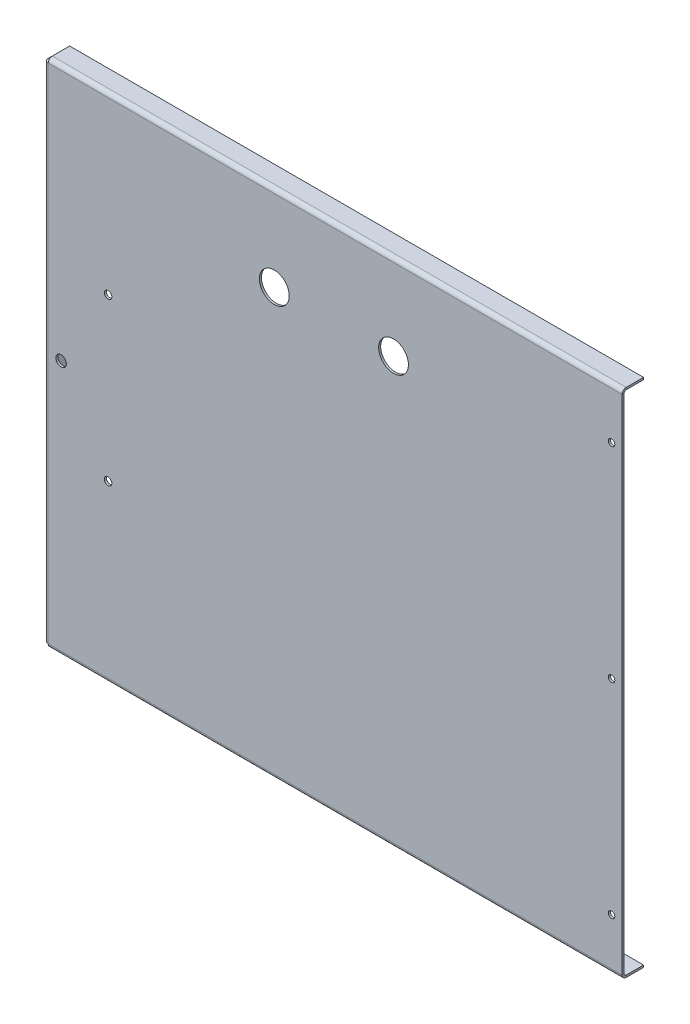
ISO-10303-21;
HEADER;
FILE_DESCRIPTION(('STEP AP214'),'2;1');
FILE_NAME('part.step','',(''),(''),'','','');
FILE_SCHEMA(('AUTOMOTIVE_DESIGN { 1 0 10303 214 1 1 1 1 }'));
ENDSEC;
DATA;
#1=APPLICATION_CONTEXT('core data for automotive mechanical design processes');
#2=APPLICATION_PROTOCOL_DEFINITION('international standard','automotive_design',2000,#1);
#3=PRODUCT_CONTEXT('',#1,'mechanical');
#4=PRODUCT('Part','Part','',(#3));
#5=PRODUCT_RELATED_PRODUCT_CATEGORY('part','',(#4));
#6=PRODUCT_DEFINITION_FORMATION('','',#4);
#7=PRODUCT_DEFINITION_CONTEXT('part definition',#1,'design');
#8=PRODUCT_DEFINITION('design','',#6,#7);
#9=PRODUCT_DEFINITION_SHAPE('','',#8);
#10=(LENGTH_UNIT() NAMED_UNIT(*) SI_UNIT(.MILLI.,.METRE.));
#11=(NAMED_UNIT(*) PLANE_ANGLE_UNIT() SI_UNIT($,.RADIAN.));
#12=(NAMED_UNIT(*) SI_UNIT($,.STERADIAN.) SOLID_ANGLE_UNIT());
#13=UNCERTAINTY_MEASURE_WITH_UNIT(LENGTH_MEASURE(1.E-05),#10,'distance_accuracy_value','');
#14=(GEOMETRIC_REPRESENTATION_CONTEXT(3) GLOBAL_UNCERTAINTY_ASSIGNED_CONTEXT((#13)) GLOBAL_UNIT_ASSIGNED_CONTEXT((#10,
#11,#12)) REPRESENTATION_CONTEXT('',''));
#15=CARTESIAN_POINT('',(0.,0.,0.));
#16=DIRECTION('',(0.,0.,1.));
#17=DIRECTION('',(1.,0.,0.));
#18=AXIS2_PLACEMENT_3D('',#15,#16,#17);
#19=CARTESIAN_POINT('',(-215.519,187.3758,-111.252));
#20=DIRECTION('',(0.,-1.,0.));
#21=DIRECTION('',(0.,0.,-1.));
#22=AXIS2_PLACEMENT_3D('',#19,#20,#21);
#23=PLANE('',#22);
#24=DIRECTION('',(1.,0.,0.));
#25=VECTOR('',#24,1.);
#26=CARTESIAN_POINT('',(0.,187.3758,-1.524));
#27=LINE('',#26,#25);
#28=CARTESIAN_POINT('',(-212.471,187.3758,-1.524));
#29=VERTEX_POINT('',#28);
#30=CARTESIAN_POINT('',(-212.3948,187.3758,-1.524));
#31=VERTEX_POINT('',#30);
#32=EDGE_CURVE('E330',#29,#31,#27,.T.);
#33=ORIENTED_EDGE('',*,*,#32,.F.);
#34=DIRECTION('',(0.,0.,1.));
#35=VECTOR('',#34,1.);
#36=CARTESIAN_POINT('',(-212.471,187.3758,-1.524));
#37=LINE('',#36,#35);
#38=CARTESIAN_POINT('',(-212.471,187.3758,0.));
#39=VERTEX_POINT('',#38);
#40=EDGE_CURVE('E13',#29,#39,#37,.T.);
#41=ORIENTED_EDGE('',*,*,#40,.T.);
#42=DIRECTION('',(1.,0.,0.));
#43=VECTOR('',#42,1.);
#44=CARTESIAN_POINT('',(-215.519,187.3758,0.));
#45=LINE('',#44,#43);
#46=CARTESIAN_POINT('',(-212.3948,187.3758,0.));
#47=VERTEX_POINT('',#46);
#48=EDGE_CURVE('E263',#39,#47,#45,.T.);
#49=ORIENTED_EDGE('',*,*,#48,.T.);
#50=DIRECTION('',(0.,0.,1.));
#51=VECTOR('',#50,1.);
#52=CARTESIAN_POINT('',(-212.3948,187.3758,-111.252));
#53=LINE('',#52,#51);
#54=EDGE_CURVE('E247',#31,#47,#53,.T.);
#55=ORIENTED_EDGE('',*,*,#54,.F.);
#56=EDGE_LOOP('',(#33,#41,#49,#55));
#57=FACE_BOUND('',#56,.T.);
#58=ADVANCED_FACE('F110',(#57),#23,.F.);
#59=DIRECTION('',(0.,0.,1.));
#60=VECTOR('',#59,1.);
#61=CARTESIAN_POINT('',(-215.519,187.3758,-111.252));
#62=LINE('',#61,#60);
#63=CARTESIAN_POINT('',(-215.519,187.3758,-16.002));
#64=VERTEX_POINT('',#63);
#65=CARTESIAN_POINT('',(-215.519,187.3758,-3.048));
#66=VERTEX_POINT('',#65);
#67=EDGE_CURVE('E259',#64,#66,#62,.T.);
#68=ORIENTED_EDGE('',*,*,#67,.T.);
#69=DIRECTION('',(1.,0.,0.));
#70=VECTOR('',#69,1.);
#71=CARTESIAN_POINT('',(-215.519,187.3758,-3.048));
#72=LINE('',#71,#70);
#73=CARTESIAN_POINT('',(-213.995,187.3758,-3.048));
#74=VERTEX_POINT('',#73);
#75=EDGE_CURVE('E119',#66,#74,#72,.T.);
#76=ORIENTED_EDGE('',*,*,#75,.T.);
#77=DIRECTION('',(0.,0.,-1.));
#78=VECTOR('',#77,1.);
#79=CARTESIAN_POINT('',(-213.995,187.3758,8.26337049468812E-13));
#80=LINE('',#79,#78);
#81=CARTESIAN_POINT('',(-213.995,187.3758,-16.002));
#82=VERTEX_POINT('',#81);
#83=EDGE_CURVE('E126',#74,#82,#80,.T.);
#84=ORIENTED_EDGE('',*,*,#83,.T.);
#85=DIRECTION('',(-1.,0.,0.));
#86=VECTOR('',#85,1.);
#87=CARTESIAN_POINT('',(-215.519,187.3758,-16.002));
#88=LINE('',#87,#86);
#89=EDGE_CURVE('E524',#82,#64,#88,.T.);
#90=ORIENTED_EDGE('',*,*,#89,.T.);
#91=EDGE_LOOP('',(#68,#76,#84,#90));
#92=FACE_BOUND('',#91,.T.);
#93=ADVANCED_FACE('F555',(#92),#23,.F.);
#94=CARTESIAN_POINT('',(-212.3948,190.5,-111.252));
#95=DIRECTION('',(1.,0.,0.));
#96=DIRECTION('',(0.,0.,-1.));
#97=AXIS2_PLACEMENT_3D('',#94,#95,#96);
#98=PLANE('',#97);
#99=DIRECTION('',(0.,0.,-1.));
#100=VECTOR('',#99,1.);
#101=CARTESIAN_POINT('',(-212.3948,188.976,7.30409884621813E-13));
#102=LINE('',#101,#100);
#103=CARTESIAN_POINT('',(-212.3948,188.976,-3.048));
#104=VERTEX_POINT('',#103);
#105=CARTESIAN_POINT('',(-212.3948,188.976,-16.002));
#106=VERTEX_POINT('',#105);
#107=EDGE_CURVE('E352',#104,#106,#102,.T.);
#108=ORIENTED_EDGE('',*,*,#107,.F.);
#109=DIRECTION('',(0.,1.,0.));
#110=VECTOR('',#109,1.);
#111=CARTESIAN_POINT('',(-212.3948,188.976,-3.048));
#112=LINE('',#111,#110);
#113=CARTESIAN_POINT('',(-212.3948,190.5,-3.048));
#114=VERTEX_POINT('',#113);
#115=EDGE_CURVE('E548',#104,#114,#112,.T.);
#116=ORIENTED_EDGE('',*,*,#115,.T.);
#117=DIRECTION('',(0.,0.,1.));
#118=VECTOR('',#117,1.);
#119=CARTESIAN_POINT('',(-212.3948,190.5,-111.252));
#120=LINE('',#119,#118);
#121=CARTESIAN_POINT('',(-212.3948,190.5,-16.002));
#122=VERTEX_POINT('',#121);
#123=EDGE_CURVE('E269',#122,#114,#120,.T.);
#124=ORIENTED_EDGE('',*,*,#123,.F.);
#125=DIRECTION('',(0.,-1.,0.));
#126=VECTOR('',#125,1.);
#127=CARTESIAN_POINT('',(-212.3948,190.5,-16.002));
#128=LINE('',#127,#126);
#129=EDGE_CURVE('E530',#122,#106,#128,.T.);
#130=ORIENTED_EDGE('',*,*,#129,.T.);
#131=EDGE_LOOP('',(#108,#116,#124,#130));
#132=FACE_BOUND('',#131,.T.);
#133=ADVANCED_FACE('F655',(#132),#98,.F.);
#134=DIRECTION('',(0.,1.,0.));
#135=VECTOR('',#134,1.);
#136=CARTESIAN_POINT('',(-212.3948,190.5,0.));
#137=LINE('',#136,#135);
#138=CARTESIAN_POINT('',(-212.3948,187.452,0.));
#139=VERTEX_POINT('',#138);
#140=EDGE_CURVE('E251',#47,#139,#137,.T.);
#141=ORIENTED_EDGE('',*,*,#140,.T.);
#142=DIRECTION('',(0.,0.,-1.));
#143=VECTOR('',#142,1.);
#144=CARTESIAN_POINT('',(-212.3948,187.452,0.));
#145=LINE('',#144,#143);
#146=CARTESIAN_POINT('',(-212.3948,187.452,-1.524));
#147=VERTEX_POINT('',#146);
#148=EDGE_CURVE('E545',#139,#147,#145,.T.);
#149=ORIENTED_EDGE('',*,*,#148,.T.);
#150=DIRECTION('',(0.,1.,0.));
#151=VECTOR('',#150,1.);
#152=CARTESIAN_POINT('',(-212.3948,0.,-1.524));
#153=LINE('',#152,#151);
#154=EDGE_CURVE('E254',#31,#147,#153,.T.);
#155=ORIENTED_EDGE('',*,*,#154,.F.);
#156=ORIENTED_EDGE('',*,*,#54,.T.);
#157=EDGE_LOOP('',(#141,#149,#155,#156));
#158=FACE_BOUND('',#157,.T.);
#159=ADVANCED_FACE('F249',(#158),#98,.F.);
#160=CARTESIAN_POINT('',(-212.3948,-187.3758,-111.252));
#161=DIRECTION('',(1.,0.,0.));
#162=DIRECTION('',(0.,0.,-1.));
#163=AXIS2_PLACEMENT_3D('',#160,#161,#162);
#164=PLANE('',#163);
#165=DIRECTION('',(0.,1.,0.));
#166=VECTOR('',#165,1.);
#167=CARTESIAN_POINT('',(-212.3948,0.,-1.524));
#168=LINE('',#167,#166);
#169=CARTESIAN_POINT('',(-212.3948,-187.452,-1.52399999999996));
#170=VERTEX_POINT('',#169);
#171=CARTESIAN_POINT('',(-212.3948,-187.3758,-1.524));
#172=VERTEX_POINT('',#171);
#173=EDGE_CURVE('E316',#170,#172,#168,.T.);
#174=ORIENTED_EDGE('',*,*,#173,.F.);
#175=DIRECTION('',(0.,0.,1.));
#176=VECTOR('',#175,1.);
#177=CARTESIAN_POINT('',(-212.3948,-187.452,-1.52399999999996));
#178=LINE('',#177,#176);
#179=CARTESIAN_POINT('',(-212.3948,-187.452,0.));
#180=VERTEX_POINT('',#179);
#181=EDGE_CURVE('E542',#170,#180,#178,.T.);
#182=ORIENTED_EDGE('',*,*,#181,.T.);
#183=DIRECTION('',(0.,1.,0.));
#184=VECTOR('',#183,1.);
#185=CARTESIAN_POINT('',(-212.3948,-187.3758,0.));
#186=LINE('',#185,#184);
#187=CARTESIAN_POINT('',(-212.3948,-187.3758,0.));
#188=VERTEX_POINT('',#187);
#189=EDGE_CURVE('E260',#180,#188,#186,.T.);
#190=ORIENTED_EDGE('',*,*,#189,.T.);
#191=DIRECTION('',(0.,0.,1.));
#192=VECTOR('',#191,1.);
#193=CARTESIAN_POINT('',(-212.3948,-187.3758,-111.252));
#194=LINE('',#193,#192);
#195=EDGE_CURVE('E292',#172,#188,#194,.T.);
#196=ORIENTED_EDGE('',*,*,#195,.F.);
#197=EDGE_LOOP('',(#174,#182,#190,#196));
#198=FACE_BOUND('',#197,.T.);
#199=ADVANCED_FACE('F579',(#198),#164,.F.);
#200=DIRECTION('',(0.,0.,1.));
#201=VECTOR('',#200,1.);
#202=CARTESIAN_POINT('',(-212.3948,-190.5,-111.252));
#203=LINE('',#202,#201);
#204=CARTESIAN_POINT('',(-212.3948,-190.5,-16.002));
#205=VERTEX_POINT('',#204);
#206=CARTESIAN_POINT('',(-212.3948,-190.5,-3.04799999999997));
#207=VERTEX_POINT('',#206);
#208=EDGE_CURVE('E287',#205,#207,#203,.T.);
#209=ORIENTED_EDGE('',*,*,#208,.T.);
#210=DIRECTION('',(0.,1.,0.));
#211=VECTOR('',#210,1.);
#212=CARTESIAN_POINT('',(-212.3948,-190.5,-3.04799999999997));
#213=LINE('',#212,#211);
#214=CARTESIAN_POINT('',(-212.3948,-188.976,-3.04799999999997));
#215=VERTEX_POINT('',#214);
#216=EDGE_CURVE('E539',#207,#215,#213,.T.);
#217=ORIENTED_EDGE('',*,*,#216,.T.);
#218=DIRECTION('',(0.,0.,-1.));
#219=VECTOR('',#218,1.);
#220=CARTESIAN_POINT('',(-212.3948,-188.976,7.30409884621813E-13));
#221=LINE('',#220,#219);
#222=CARTESIAN_POINT('',(-212.3948,-188.976,-16.002));
#223=VERTEX_POINT('',#222);
#224=EDGE_CURVE('E134',#215,#223,#221,.T.);
#225=ORIENTED_EDGE('',*,*,#224,.T.);
#226=DIRECTION('',(0.,-1.,0.));
#227=VECTOR('',#226,1.);
#228=CARTESIAN_POINT('',(-212.3948,-190.5,-16.002));
#229=LINE('',#228,#227);
#230=EDGE_CURVE('E519',#223,#205,#229,.T.);
#231=ORIENTED_EDGE('',*,*,#230,.T.);
#232=EDGE_LOOP('',(#209,#217,#225,#231));
#233=FACE_BOUND('',#232,.T.);
#234=ADVANCED_FACE('F669',(#233),#164,.F.);
#235=CARTESIAN_POINT('',(-215.519,-187.3758,-111.252));
#236=DIRECTION('',(0.,1.,0.));
#237=DIRECTION('',(0.,0.,1.));
#238=AXIS2_PLACEMENT_3D('',#235,#236,#237);
#239=PLANE('',#238);
#240=DIRECTION('',(0.,0.,1.));
#241=VECTOR('',#240,1.);
#242=CARTESIAN_POINT('',(-213.995,-187.3758,8.26337049468812E-13));
#243=LINE('',#242,#241);
#244=CARTESIAN_POINT('',(-213.995,-187.3758,-16.002));
#245=VERTEX_POINT('',#244);
#246=CARTESIAN_POINT('',(-213.995,-187.3758,-3.048));
#247=VERTEX_POINT('',#246);
#248=EDGE_CURVE('E336',#245,#247,#243,.T.);
#249=ORIENTED_EDGE('',*,*,#248,.T.);
#250=DIRECTION('',(-1.,0.,0.));
#251=VECTOR('',#250,1.);
#252=CARTESIAN_POINT('',(-213.995,-187.3758,-3.048));
#253=LINE('',#252,#251);
#254=CARTESIAN_POINT('',(-215.519,-187.3758,-3.048));
#255=VERTEX_POINT('',#254);
#256=EDGE_CURVE('E536',#247,#255,#253,.T.);
#257=ORIENTED_EDGE('',*,*,#256,.T.);
#258=DIRECTION('',(0.,0.,1.));
#259=VECTOR('',#258,1.);
#260=CARTESIAN_POINT('',(-215.519,-187.3758,-111.252));
#261=LINE('',#260,#259);
#262=CARTESIAN_POINT('',(-215.519,-187.3758,-16.002));
#263=VERTEX_POINT('',#262);
#264=EDGE_CURVE('E295',#263,#255,#261,.T.);
#265=ORIENTED_EDGE('',*,*,#264,.F.);
#266=DIRECTION('',(1.,0.,0.));
#267=VECTOR('',#266,1.);
#268=CARTESIAN_POINT('',(-215.519,-187.3758,-16.002));
#269=LINE('',#268,#267);
#270=EDGE_CURVE('E527',#263,#245,#269,.T.);
#271=ORIENTED_EDGE('',*,*,#270,.T.);
#272=EDGE_LOOP('',(#249,#257,#265,#271));
#273=FACE_BOUND('',#272,.T.);
#274=ADVANCED_FACE('F591',(#273),#239,.F.);
#275=DIRECTION('',(-1.,0.,0.));
#276=VECTOR('',#275,1.);
#277=CARTESIAN_POINT('',(-215.519,-187.3758,0.));
#278=LINE('',#277,#276);
#279=CARTESIAN_POINT('',(-212.471,-187.3758,0.));
#280=VERTEX_POINT('',#279);
#281=EDGE_CURVE('E291',#188,#280,#278,.T.);
#282=ORIENTED_EDGE('',*,*,#281,.T.);
#283=DIRECTION('',(0.,0.,-1.));
#284=VECTOR('',#283,1.);
#285=CARTESIAN_POINT('',(-212.471,-187.3758,0.));
#286=LINE('',#285,#284);
#287=CARTESIAN_POINT('',(-212.471,-187.3758,-1.524));
#288=VERTEX_POINT('',#287);
#289=EDGE_CURVE('E533',#280,#288,#286,.T.);
#290=ORIENTED_EDGE('',*,*,#289,.T.);
#291=DIRECTION('',(-1.,0.,0.));
#292=VECTOR('',#291,1.);
#293=CARTESIAN_POINT('',(0.,-187.3758,-1.524));
#294=LINE('',#293,#292);
#295=EDGE_CURVE('E344',#172,#288,#294,.T.);
#296=ORIENTED_EDGE('',*,*,#295,.F.);
#297=ORIENTED_EDGE('',*,*,#195,.T.);
#298=EDGE_LOOP('',(#282,#290,#296,#297));
#299=FACE_BOUND('',#298,.T.);
#300=ADVANCED_FACE('F577',(#299),#239,.F.);
#301=CARTESIAN_POINT('',(0.,0.,-1.524));
#302=DIRECTION('',(0.,0.,1.));
#303=DIRECTION('',(1.,0.,0.));
#304=AXIS2_PLACEMENT_3D('',#301,#302,#303);
#305=PLANE('',#304);
#306=CARTESIAN_POINT('',(-202.819,0.,-1.524));
#307=DIRECTION('',(0.,0.,1.));
#308=DIRECTION('',(1.,0.,0.));
#309=AXIS2_PLACEMENT_3D('',#306,#307,#308);
#310=CIRCLE('',#309,3.937);
#311=CARTESIAN_POINT('',(-198.882,0.,-1.524));
#312=VERTEX_POINT('',#311);
#313=EDGE_CURVE('E394',#312,#312,#310,.T.);
#314=ORIENTED_EDGE('',*,*,#313,.T.);
#315=EDGE_LOOP('',(#314));
#316=FACE_BOUND('',#315,.T.);
#317=CARTESIAN_POINT('',(-167.767,60.198,-1.524));
#318=DIRECTION('',(0.,0.,1.));
#319=DIRECTION('',(1.,0.,0.));
#320=AXIS2_PLACEMENT_3D('',#317,#318,#319);
#321=CIRCLE('',#320,2.79399999999998);
#322=CARTESIAN_POINT('',(-164.973,60.198,-1.524));
#323=VERTEX_POINT('',#322);
#324=EDGE_CURVE('E390',#323,#323,#321,.T.);
#325=ORIENTED_EDGE('',*,*,#324,.T.);
#326=EDGE_LOOP('',(#325));
#327=FACE_BOUND('',#326,.T.);
#328=CARTESIAN_POINT('',(-167.767,-60.1979999999999,-1.524));
#329=DIRECTION('',(0.,0.,1.));
#330=DIRECTION('',(1.,0.,0.));
#331=AXIS2_PLACEMENT_3D('',#328,#329,#330);
#332=CIRCLE('',#331,2.79399999999998);
#333=CARTESIAN_POINT('',(-164.973,-60.1979999999999,-1.524));
#334=VERTEX_POINT('',#333);
#335=EDGE_CURVE('E386',#334,#334,#332,.T.);
#336=ORIENTED_EDGE('',*,*,#335,.T.);
#337=EDGE_LOOP('',(#336));
#338=FACE_BOUND('',#337,.T.);
#339=CARTESIAN_POINT('',(207.645,0.,-1.524));
#340=DIRECTION('',(0.,0.,1.));
#341=DIRECTION('',(1.,0.,0.));
#342=AXIS2_PLACEMENT_3D('',#339,#340,#341);
#343=CIRCLE('',#342,2.413);
#344=CARTESIAN_POINT('',(210.058,0.,-1.524));
#345=VERTEX_POINT('',#344);
#346=EDGE_CURVE('E382',#345,#345,#343,.T.);
#347=ORIENTED_EDGE('',*,*,#346,.T.);
#348=EDGE_LOOP('',(#347));
#349=FACE_BOUND('',#348,.T.);
#350=CARTESIAN_POINT('',(207.645,-152.4,-1.524));
#351=DIRECTION('',(0.,0.,1.));
#352=DIRECTION('',(1.,0.,0.));
#353=AXIS2_PLACEMENT_3D('',#350,#351,#352);
#354=CIRCLE('',#353,2.413);
#355=CARTESIAN_POINT('',(210.058,-152.4,-1.524));
#356=VERTEX_POINT('',#355);
#357=EDGE_CURVE('E378',#356,#356,#354,.T.);
#358=ORIENTED_EDGE('',*,*,#357,.T.);
#359=EDGE_LOOP('',(#358));
#360=FACE_BOUND('',#359,.T.);
#361=CARTESIAN_POINT('',(207.645,152.4,-1.524));
#362=DIRECTION('',(0.,0.,1.));
#363=DIRECTION('',(1.,0.,0.));
#364=AXIS2_PLACEMENT_3D('',#361,#362,#363);
#365=CIRCLE('',#364,2.413);
#366=CARTESIAN_POINT('',(210.058,152.4,-1.524));
#367=VERTEX_POINT('',#366);
#368=EDGE_CURVE('E374',#367,#367,#365,.T.);
#369=ORIENTED_EDGE('',*,*,#368,.T.);
#370=EDGE_LOOP('',(#369));
#371=FACE_BOUND('',#370,.T.);
#372=CARTESIAN_POINT('',(45.0849999999999,127.,-1.524));
#373=DIRECTION('',(0.,0.,1.));
#374=DIRECTION('',(1.,0.,0.));
#375=AXIS2_PLACEMENT_3D('',#372,#373,#374);
#376=CIRCLE('',#375,11.1125);
#377=CARTESIAN_POINT('',(56.1974999999999,127.,-1.524));
#378=VERTEX_POINT('',#377);
#379=EDGE_CURVE('E370',#378,#378,#376,.T.);
#380=ORIENTED_EDGE('',*,*,#379,.T.);
#381=EDGE_LOOP('',(#380));
#382=FACE_BOUND('',#381,.T.);
#383=CARTESIAN_POINT('',(-43.8150000000001,127.,-1.524));
#384=DIRECTION('',(0.,0.,1.));
#385=DIRECTION('',(1.,0.,0.));
#386=AXIS2_PLACEMENT_3D('',#383,#384,#385);
#387=CIRCLE('',#386,11.1125);
#388=CARTESIAN_POINT('',(-32.7025000000001,127.,-1.524));
#389=VERTEX_POINT('',#388);
#390=EDGE_CURVE('E366',#389,#389,#387,.T.);
#391=ORIENTED_EDGE('',*,*,#390,.T.);
#392=EDGE_LOOP('',(#391));
#393=FACE_BOUND('',#392,.T.);
#394=ORIENTED_EDGE('',*,*,#173,.T.);
#395=ORIENTED_EDGE('',*,*,#295,.T.);
#396=DIRECTION('',(0.,1.,0.));
#397=VECTOR('',#396,1.);
#398=CARTESIAN_POINT('',(-212.471,188.268893218813,-1.524));
#399=LINE('',#398,#397);
#400=EDGE_CURVE('E450',#29,#288,#399,.F.);
#401=ORIENTED_EDGE('',*,*,#400,.F.);
#402=ORIENTED_EDGE('',*,*,#32,.T.);
#403=ORIENTED_EDGE('',*,*,#154,.T.);
#404=DIRECTION('',(1.,0.,0.));
#405=VECTOR('',#404,1.);
#406=CARTESIAN_POINT('',(215.519,187.452,-1.524));
#407=LINE('',#406,#405);
#408=CARTESIAN_POINT('',(215.519,187.452,-1.524));
#409=VERTEX_POINT('',#408);
#410=EDGE_CURVE('E501',#409,#147,#407,.F.);
#411=ORIENTED_EDGE('',*,*,#410,.F.);
#412=DIRECTION('',(0.,1.,0.));
#413=VECTOR('',#412,1.);
#414=CARTESIAN_POINT('',(215.519,190.5,-1.524));
#415=LINE('',#414,#413);
#416=CARTESIAN_POINT('',(215.519,-187.452,-1.52400000000002));
#417=VERTEX_POINT('',#416);
#418=EDGE_CURVE('E515',#417,#409,#415,.T.);
#419=ORIENTED_EDGE('',*,*,#418,.F.);
#420=DIRECTION('',(-1.,0.,0.));
#421=VECTOR('',#420,1.);
#422=CARTESIAN_POINT('',(-213.287893218814,-187.452,-1.52399999999996));
#423=LINE('',#422,#421);
#424=EDGE_CURVE('E403',#170,#417,#423,.F.);
#425=ORIENTED_EDGE('',*,*,#424,.F.);
#426=EDGE_LOOP('',(#394,#395,#401,#402,#403,#411,#419,#425));
#427=FACE_BOUND('',#426,.T.);
#428=ADVANCED_FACE('F572',(#316,#327,#338,#349,#360,#371,#382,#393,#427),#305,.F.);
#429=CARTESIAN_POINT('',(0.,0.,0.));
#430=DIRECTION('',(0.,0.,1.));
#431=DIRECTION('',(1.,0.,0.));
#432=AXIS2_PLACEMENT_3D('',#429,#430,#431);
#433=PLANE('',#432);
#434=ORIENTED_EDGE('',*,*,#281,.F.);
#435=ORIENTED_EDGE('',*,*,#189,.F.);
#436=DIRECTION('',(-1.,0.,0.));
#437=VECTOR('',#436,1.);
#438=CARTESIAN_POINT('',(-213.287893218814,-187.452,0.));
#439=LINE('',#438,#437);
#440=CARTESIAN_POINT('',(215.519,-187.452,0.));
#441=VERTEX_POINT('',#440);
#442=EDGE_CURVE('E433',#180,#441,#439,.F.);
#443=ORIENTED_EDGE('',*,*,#442,.T.);
#444=DIRECTION('',(0.,1.,0.));
#445=VECTOR('',#444,1.);
#446=CARTESIAN_POINT('',(215.519,190.5,0.));
#447=LINE('',#446,#445);
#448=CARTESIAN_POINT('',(215.519,187.452,0.));
#449=VERTEX_POINT('',#448);
#450=EDGE_CURVE('E514',#441,#449,#447,.T.);
#451=ORIENTED_EDGE('',*,*,#450,.T.);
#452=DIRECTION('',(1.,0.,0.));
#453=VECTOR('',#452,1.);
#454=CARTESIAN_POINT('',(215.519,187.452,0.));
#455=LINE('',#454,#453);
#456=EDGE_CURVE('E276',#449,#139,#455,.F.);
#457=ORIENTED_EDGE('',*,*,#456,.T.);
#458=ORIENTED_EDGE('',*,*,#140,.F.);
#459=ORIENTED_EDGE('',*,*,#48,.F.);
#460=DIRECTION('',(0.,1.,0.));
#461=VECTOR('',#460,1.);
#462=CARTESIAN_POINT('',(-212.471,188.268893218813,0.));
#463=LINE('',#462,#461);
#464=EDGE_CURVE('E465',#39,#280,#463,.F.);
#465=ORIENTED_EDGE('',*,*,#464,.T.);
#466=EDGE_LOOP('',(#434,#435,#443,#451,#457,#458,#459,#465));
#467=FACE_BOUND('',#466,.T.);
#468=CARTESIAN_POINT('',(-202.819,0.,0.));
#469=DIRECTION('',(0.,0.,1.));
#470=DIRECTION('',(1.,0.,0.));
#471=AXIS2_PLACEMENT_3D('',#468,#469,#470);
#472=CIRCLE('',#471,3.937);
#473=CARTESIAN_POINT('',(-198.882,0.,0.));
#474=VERTEX_POINT('',#473);
#475=EDGE_CURVE('E278',#474,#474,#472,.T.);
#476=ORIENTED_EDGE('',*,*,#475,.F.);
#477=EDGE_LOOP('',(#476));
#478=FACE_BOUND('',#477,.T.);
#479=CARTESIAN_POINT('',(-167.767,60.198,0.));
#480=DIRECTION('',(0.,0.,1.));
#481=DIRECTION('',(1.,0.,0.));
#482=AXIS2_PLACEMENT_3D('',#479,#480,#481);
#483=CIRCLE('',#482,2.79399999999998);
#484=CARTESIAN_POINT('',(-164.973,60.198,0.));
#485=VERTEX_POINT('',#484);
#486=EDGE_CURVE('E284',#485,#485,#483,.T.);
#487=ORIENTED_EDGE('',*,*,#486,.F.);
#488=EDGE_LOOP('',(#487));
#489=FACE_BOUND('',#488,.T.);
#490=CARTESIAN_POINT('',(-167.767,-60.1979999999999,0.));
#491=DIRECTION('',(0.,0.,1.));
#492=DIRECTION('',(1.,0.,0.));
#493=AXIS2_PLACEMENT_3D('',#490,#491,#492);
#494=CIRCLE('',#493,2.79399999999998);
#495=CARTESIAN_POINT('',(-164.973,-60.1979999999999,0.));
#496=VERTEX_POINT('',#495);
#497=EDGE_CURVE('E605',#496,#496,#494,.T.);
#498=ORIENTED_EDGE('',*,*,#497,.F.);
#499=EDGE_LOOP('',(#498));
#500=FACE_BOUND('',#499,.T.);
#501=CARTESIAN_POINT('',(207.645,0.,0.));
#502=DIRECTION('',(0.,0.,1.));
#503=DIRECTION('',(1.,0.,0.));
#504=AXIS2_PLACEMENT_3D('',#501,#502,#503);
#505=CIRCLE('',#504,2.413);
#506=CARTESIAN_POINT('',(210.058,0.,0.));
#507=VERTEX_POINT('',#506);
#508=EDGE_CURVE('E609',#507,#507,#505,.T.);
#509=ORIENTED_EDGE('',*,*,#508,.F.);
#510=EDGE_LOOP('',(#509));
#511=FACE_BOUND('',#510,.T.);
#512=CARTESIAN_POINT('',(207.645,-152.4,0.));
#513=DIRECTION('',(0.,0.,1.));
#514=DIRECTION('',(1.,0.,0.));
#515=AXIS2_PLACEMENT_3D('',#512,#513,#514);
#516=CIRCLE('',#515,2.413);
#517=CARTESIAN_POINT('',(210.058,-152.4,0.));
#518=VERTEX_POINT('',#517);
#519=EDGE_CURVE('E613',#518,#518,#516,.T.);
#520=ORIENTED_EDGE('',*,*,#519,.F.);
#521=EDGE_LOOP('',(#520));
#522=FACE_BOUND('',#521,.T.);
#523=CARTESIAN_POINT('',(207.645,152.4,0.));
#524=DIRECTION('',(0.,0.,1.));
#525=DIRECTION('',(1.,0.,0.));
#526=AXIS2_PLACEMENT_3D('',#523,#524,#525);
#527=CIRCLE('',#526,2.413);
#528=CARTESIAN_POINT('',(210.058,152.4,0.));
#529=VERTEX_POINT('',#528);
#530=EDGE_CURVE('E617',#529,#529,#527,.T.);
#531=ORIENTED_EDGE('',*,*,#530,.F.);
#532=EDGE_LOOP('',(#531));
#533=FACE_BOUND('',#532,.T.);
#534=CARTESIAN_POINT('',(45.0849999999999,127.,0.));
#535=DIRECTION('',(0.,0.,1.));
#536=DIRECTION('',(1.,0.,0.));
#537=AXIS2_PLACEMENT_3D('',#534,#535,#536);
#538=CIRCLE('',#537,11.1125);
#539=CARTESIAN_POINT('',(56.1974999999999,127.,0.));
#540=VERTEX_POINT('',#539);
#541=EDGE_CURVE('E309',#540,#540,#538,.T.);
#542=ORIENTED_EDGE('',*,*,#541,.F.);
#543=EDGE_LOOP('',(#542));
#544=FACE_BOUND('',#543,.T.);
#545=CARTESIAN_POINT('',(-43.8150000000001,127.,0.));
#546=DIRECTION('',(0.,0.,1.));
#547=DIRECTION('',(1.,0.,0.));
#548=AXIS2_PLACEMENT_3D('',#545,#546,#547);
#549=CIRCLE('',#548,11.1125);
#550=CARTESIAN_POINT('',(-32.7025000000001,127.,0.));
#551=VERTEX_POINT('',#550);
#552=EDGE_CURVE('E305',#551,#551,#549,.T.);
#553=ORIENTED_EDGE('',*,*,#552,.F.);
#554=EDGE_LOOP('',(#553));
#555=FACE_BOUND('',#554,.T.);
#556=ADVANCED_FACE('F273',(#467,#478,#489,#500,#511,#522,#533,#544,#555),#433,.T.);
#557=CARTESIAN_POINT('',(215.519,190.5,-1.524));
#558=DIRECTION('',(1.,0.,0.));
#559=DIRECTION('',(0.,0.,-1.));
#560=AXIS2_PLACEMENT_3D('',#557,#558,#559);
#561=PLANE('',#560);
#562=DIRECTION('',(0.,0.,1.));
#563=VECTOR('',#562,1.);
#564=CARTESIAN_POINT('',(215.519,-187.452,-1.52400000000002));
#565=LINE('',#564,#563);
#566=EDGE_CURVE('E432',#417,#441,#565,.T.);
#567=ORIENTED_EDGE('',*,*,#566,.F.);
#568=ORIENTED_EDGE('',*,*,#418,.T.);
#569=DIRECTION('',(0.,0.,1.));
#570=VECTOR('',#569,1.);
#571=CARTESIAN_POINT('',(215.519,187.452,-1.524));
#572=LINE('',#571,#570);
#573=EDGE_CURVE('E510',#409,#449,#572,.T.);
#574=ORIENTED_EDGE('',*,*,#573,.T.);
#575=ORIENTED_EDGE('',*,*,#450,.F.);
#576=EDGE_LOOP('',(#567,#568,#574,#575));
#577=FACE_BOUND('',#576,.T.);
#578=ADVANCED_FACE('F112',(#577),#561,.T.);
#579=CARTESIAN_POINT('',(215.519,187.452,-3.048));
#580=DIRECTION('',(-1.,0.,0.));
#581=DIRECTION('',(0.,0.,1.));
#582=AXIS2_PLACEMENT_3D('',#579,#580,#581);
#583=PLANE('',#582);
#584=CARTESIAN_POINT('',(215.519,187.452,-3.048));
#585=DIRECTION('',(1.,0.,0.));
#586=DIRECTION('',(0.,0.,-1.));
#587=AXIS2_PLACEMENT_3D('',#584,#585,#586);
#588=CIRCLE('',#587,1.524);
#589=CARTESIAN_POINT('',(215.519,188.976,-3.048));
#590=VERTEX_POINT('',#589);
#591=EDGE_CURVE('E473',#590,#409,#588,.T.);
#592=ORIENTED_EDGE('',*,*,#591,.F.);
#593=DIRECTION('',(0.,1.,0.));
#594=VECTOR('',#593,1.);
#595=CARTESIAN_POINT('',(215.519,188.976,-3.048));
#596=LINE('',#595,#594);
#597=CARTESIAN_POINT('',(215.519,190.5,-3.04799999999999));
#598=VERTEX_POINT('',#597);
#599=EDGE_CURVE('E491',#590,#598,#596,.T.);
#600=ORIENTED_EDGE('',*,*,#599,.T.);
#601=CARTESIAN_POINT('',(215.519,187.452,-3.048));
#602=DIRECTION('',(1.,0.,0.));
#603=DIRECTION('',(0.,0.,-1.));
#604=AXIS2_PLACEMENT_3D('',#601,#602,#603);
#605=CIRCLE('',#604,3.048);
#606=EDGE_CURVE('E497',#598,#449,#605,.T.);
#607=ORIENTED_EDGE('',*,*,#606,.T.);
#608=ORIENTED_EDGE('',*,*,#573,.F.);
#609=EDGE_LOOP('',(#592,#600,#607,#608));
#610=FACE_BOUND('',#609,.T.);
#611=ADVANCED_FACE('F739',(#610),#583,.F.);
#612=CARTESIAN_POINT('',(215.519,187.452,-3.048));
#613=DIRECTION('',(1.,0.,0.));
#614=DIRECTION('',(0.,1.,0.));
#615=AXIS2_PLACEMENT_3D('',#612,#613,#614);
#616=CYLINDRICAL_SURFACE('',#615,3.048);
#617=CARTESIAN_POINT('',(-212.3948,187.452,-3.048));
#618=DIRECTION('',(1.,0.,0.));
#619=DIRECTION('',(0.,0.,-1.));
#620=AXIS2_PLACEMENT_3D('',#617,#618,#619);
#621=CIRCLE('',#620,3.048);
#622=EDGE_CURVE('E362',#139,#114,#621,.F.);
#623=ORIENTED_EDGE('',*,*,#622,.F.);
#624=ORIENTED_EDGE('',*,*,#456,.F.);
#625=ORIENTED_EDGE('',*,*,#606,.F.);
#626=DIRECTION('',(1.,0.,0.));
#627=VECTOR('',#626,1.);
#628=CARTESIAN_POINT('',(0.,190.5,-3.04799999999999));
#629=LINE('',#628,#627);
#630=EDGE_CURVE('E488',#114,#598,#629,.T.);
#631=ORIENTED_EDGE('',*,*,#630,.F.);
#632=EDGE_LOOP('',(#623,#624,#625,#631));
#633=FACE_BOUND('',#632,.T.);
#634=ADVANCED_FACE('F736',(#633),#616,.T.);
#635=CARTESIAN_POINT('',(215.519,187.452,-3.048));
#636=DIRECTION('',(1.,0.,0.));
#637=DIRECTION('',(0.,1.,0.));
#638=AXIS2_PLACEMENT_3D('',#635,#636,#637);
#639=CYLINDRICAL_SURFACE('',#638,1.524);
#640=ORIENTED_EDGE('',*,*,#410,.T.);
#641=CARTESIAN_POINT('',(-212.3948,187.452,-3.048));
#642=DIRECTION('',(1.,0.,0.));
#643=DIRECTION('',(0.,0.,-1.));
#644=AXIS2_PLACEMENT_3D('',#641,#642,#643);
#645=CIRCLE('',#644,1.524);
#646=EDGE_CURVE('E356',#147,#104,#645,.F.);
#647=ORIENTED_EDGE('',*,*,#646,.T.);
#648=DIRECTION('',(-1.,0.,0.));
#649=VECTOR('',#648,1.);
#650=CARTESIAN_POINT('',(-215.519,188.976,-3.048));
#651=LINE('',#650,#649);
#652=EDGE_CURVE('E468',#104,#590,#651,.F.);
#653=ORIENTED_EDGE('',*,*,#652,.T.);
#654=ORIENTED_EDGE('',*,*,#591,.T.);
#655=EDGE_LOOP('',(#640,#647,#653,#654));
#656=FACE_BOUND('',#655,.T.);
#657=ADVANCED_FACE('F724',(#656),#639,.F.);
#658=CARTESIAN_POINT('',(0.,190.5,7.3573090218221E-13));
#659=DIRECTION('',(0.,1.,0.));
#660=DIRECTION('',(0.,0.,1.));
#661=AXIS2_PLACEMENT_3D('',#658,#659,#660);
#662=PLANE('',#661);
#663=ORIENTED_EDGE('',*,*,#123,.T.);
#664=ORIENTED_EDGE('',*,*,#630,.T.);
#665=DIRECTION('',(0.,0.,1.));
#666=VECTOR('',#665,1.);
#667=CARTESIAN_POINT('',(215.519,190.5,-1.52399999999999));
#668=LINE('',#667,#666);
#669=CARTESIAN_POINT('',(215.519,190.5,-16.002));
#670=VERTEX_POINT('',#669);
#671=EDGE_CURVE('E474',#670,#598,#668,.T.);
#672=ORIENTED_EDGE('',*,*,#671,.F.);
#673=DIRECTION('',(1.,0.,0.));
#674=VECTOR('',#673,1.);
#675=CARTESIAN_POINT('',(215.519,190.5,-16.002));
#676=LINE('',#675,#674);
#677=EDGE_CURVE('E478',#122,#670,#676,.T.);
#678=ORIENTED_EDGE('',*,*,#677,.F.);
#679=EDGE_LOOP('',(#663,#664,#672,#678));
#680=FACE_BOUND('',#679,.T.);
#681=ADVANCED_FACE('F720',(#680),#662,.T.);
#682=CARTESIAN_POINT('',(0.,188.976,7.30409884621813E-13));
#683=DIRECTION('',(0.,1.,0.));
#684=DIRECTION('',(0.,0.,1.));
#685=AXIS2_PLACEMENT_3D('',#682,#683,#684);
#686=PLANE('',#685);
#687=ORIENTED_EDGE('',*,*,#652,.F.);
#688=ORIENTED_EDGE('',*,*,#107,.T.);
#689=DIRECTION('',(-1.,0.,0.));
#690=VECTOR('',#689,1.);
#691=CARTESIAN_POINT('',(0.,188.976,-16.002));
#692=LINE('',#691,#690);
#693=CARTESIAN_POINT('',(215.519,188.976,-16.002));
#694=VERTEX_POINT('',#693);
#695=EDGE_CURVE('E485',#106,#694,#692,.F.);
#696=ORIENTED_EDGE('',*,*,#695,.T.);
#697=DIRECTION('',(0.,0.,-1.));
#698=VECTOR('',#697,1.);
#699=CARTESIAN_POINT('',(215.519,188.976,7.30409884621813E-13));
#700=LINE('',#699,#698);
#701=EDGE_CURVE('E481',#694,#590,#700,.F.);
#702=ORIENTED_EDGE('',*,*,#701,.T.);
#703=EDGE_LOOP('',(#687,#688,#696,#702));
#704=FACE_BOUND('',#703,.T.);
#705=ADVANCED_FACE('F723',(#704),#686,.F.);
#706=CARTESIAN_POINT('',(215.519,190.5,-16.002));
#707=DIRECTION('',(0.,0.,-1.));
#708=DIRECTION('',(0.,1.,0.));
#709=AXIS2_PLACEMENT_3D('',#706,#707,#708);
#710=PLANE('',#709);
#711=ORIENTED_EDGE('',*,*,#129,.F.);
#712=ORIENTED_EDGE('',*,*,#677,.T.);
#713=DIRECTION('',(0.,-1.,0.));
#714=VECTOR('',#713,1.);
#715=CARTESIAN_POINT('',(215.519,190.5,-16.002));
#716=LINE('',#715,#714);
#717=EDGE_CURVE('E469',#670,#694,#716,.T.);
#718=ORIENTED_EDGE('',*,*,#717,.T.);
#719=ORIENTED_EDGE('',*,*,#695,.F.);
#720=EDGE_LOOP('',(#711,#712,#718,#719));
#721=FACE_BOUND('',#720,.T.);
#722=ADVANCED_FACE('F728',(#721),#710,.T.);
#723=CARTESIAN_POINT('',(215.519,190.5,-1.52399999999999));
#724=DIRECTION('',(1.,0.,0.));
#725=DIRECTION('',(0.,0.,-1.));
#726=AXIS2_PLACEMENT_3D('',#723,#724,#725);
#727=PLANE('',#726);
#728=ORIENTED_EDGE('',*,*,#671,.T.);
#729=ORIENTED_EDGE('',*,*,#599,.F.);
#730=ORIENTED_EDGE('',*,*,#701,.F.);
#731=ORIENTED_EDGE('',*,*,#717,.F.);
#732=EDGE_LOOP('',(#728,#729,#730,#731));
#733=FACE_BOUND('',#732,.T.);
#734=ADVANCED_FACE('F717',(#733),#727,.T.);
#735=CARTESIAN_POINT('',(-212.471,188.268893218813,-3.048));
#736=DIRECTION('',(0.,1.,0.));
#737=DIRECTION('',(-1.,0.,0.));
#738=AXIS2_PLACEMENT_3D('',#735,#736,#737);
#739=CYLINDRICAL_SURFACE('',#738,3.048);
#740=CARTESIAN_POINT('',(-212.471,-187.3758,-3.048));
#741=DIRECTION('',(0.,1.,0.));
#742=DIRECTION('',(0.,0.,1.));
#743=AXIS2_PLACEMENT_3D('',#740,#741,#742);
#744=CIRCLE('',#743,3.048);
#745=EDGE_CURVE('E348',#280,#255,#744,.F.);
#746=ORIENTED_EDGE('',*,*,#745,.F.);
#747=ORIENTED_EDGE('',*,*,#464,.F.);
#748=CARTESIAN_POINT('',(-212.471,187.3758,-3.048));
#749=DIRECTION('',(0.,-1.,0.));
#750=DIRECTION('',(0.,0.,-1.));
#751=AXIS2_PLACEMENT_3D('',#748,#749,#750);
#752=CIRCLE('',#751,3.048);
#753=EDGE_CURVE('E333',#66,#39,#752,.F.);
#754=ORIENTED_EDGE('',*,*,#753,.F.);
#755=DIRECTION('',(0.,1.,0.));
#756=VECTOR('',#755,1.);
#757=CARTESIAN_POINT('',(-215.519,-190.5,-3.04799999999999));
#758=LINE('',#757,#756);
#759=EDGE_CURVE('E455',#66,#255,#758,.F.);
#760=ORIENTED_EDGE('',*,*,#759,.T.);
#761=EDGE_LOOP('',(#746,#747,#754,#760));
#762=FACE_BOUND('',#761,.T.);
#763=ADVANCED_FACE('F584',(#762),#739,.T.);
#764=CARTESIAN_POINT('',(-212.471,188.268893218813,-3.048));
#765=DIRECTION('',(0.,1.,0.));
#766=DIRECTION('',(-1.,0.,0.));
#767=AXIS2_PLACEMENT_3D('',#764,#765,#766);
#768=CYLINDRICAL_SURFACE('',#767,1.524);
#769=ORIENTED_EDGE('',*,*,#400,.T.);
#770=CARTESIAN_POINT('',(-212.471,-187.3758,-3.048));
#771=DIRECTION('',(0.,1.,0.));
#772=DIRECTION('',(0.,0.,1.));
#773=AXIS2_PLACEMENT_3D('',#770,#771,#772);
#774=CIRCLE('',#773,1.524);
#775=EDGE_CURVE('E340',#288,#247,#774,.F.);
#776=ORIENTED_EDGE('',*,*,#775,.T.);
#777=DIRECTION('',(0.,1.,0.));
#778=VECTOR('',#777,1.);
#779=CARTESIAN_POINT('',(-213.995,-190.5,-3.048));
#780=LINE('',#779,#778);
#781=EDGE_CURVE('E445',#247,#74,#780,.T.);
#782=ORIENTED_EDGE('',*,*,#781,.T.);
#783=CARTESIAN_POINT('',(-212.471,187.3758,-3.048));
#784=DIRECTION('',(0.,-1.,0.));
#785=DIRECTION('',(0.,0.,-1.));
#786=AXIS2_PLACEMENT_3D('',#783,#784,#785);
#787=CIRCLE('',#786,1.524);
#788=EDGE_CURVE('E326',#74,#29,#787,.F.);
#789=ORIENTED_EDGE('',*,*,#788,.T.);
#790=EDGE_LOOP('',(#769,#776,#782,#789));
#791=FACE_BOUND('',#790,.T.);
#792=ADVANCED_FACE('F567',(#791),#768,.F.);
#793=CARTESIAN_POINT('',(-215.519,0.,8.31658067029208E-13));
#794=DIRECTION('',(1.,0.,0.));
#795=DIRECTION('',(0.,0.,-1.));
#796=AXIS2_PLACEMENT_3D('',#793,#794,#795);
#797=PLANE('',#796);
#798=DIRECTION('',(0.,-1.,0.));
#799=VECTOR('',#798,1.);
#800=CARTESIAN_POINT('',(-215.519,-190.5,-16.002));
#801=LINE('',#800,#799);
#802=EDGE_CURVE('E446',#263,#64,#801,.F.);
#803=ORIENTED_EDGE('',*,*,#802,.F.);
#804=ORIENTED_EDGE('',*,*,#264,.T.);
#805=ORIENTED_EDGE('',*,*,#759,.F.);
#806=ORIENTED_EDGE('',*,*,#67,.F.);
#807=EDGE_LOOP('',(#803,#804,#805,#806));
#808=FACE_BOUND('',#807,.T.);
#809=ADVANCED_FACE('F588',(#808),#797,.F.);
#810=CARTESIAN_POINT('',(-213.995,0.,8.26337049468812E-13));
#811=DIRECTION('',(1.,0.,0.));
#812=DIRECTION('',(0.,0.,-1.));
#813=AXIS2_PLACEMENT_3D('',#810,#811,#812);
#814=PLANE('',#813);
#815=ORIENTED_EDGE('',*,*,#248,.F.);
#816=DIRECTION('',(0.,1.,0.));
#817=VECTOR('',#816,1.);
#818=CARTESIAN_POINT('',(-213.995,0.,-16.002));
#819=LINE('',#818,#817);
#820=EDGE_CURVE('E451',#245,#82,#819,.T.);
#821=ORIENTED_EDGE('',*,*,#820,.T.);
#822=ORIENTED_EDGE('',*,*,#83,.F.);
#823=ORIENTED_EDGE('',*,*,#781,.F.);
#824=EDGE_LOOP('',(#815,#821,#822,#823));
#825=FACE_BOUND('',#824,.T.);
#826=ADVANCED_FACE('F565',(#825),#814,.T.);
#827=CARTESIAN_POINT('',(-215.519,-190.5,-16.002));
#828=DIRECTION('',(0.,0.,-1.));
#829=DIRECTION('',(-1.,0.,0.));
#830=AXIS2_PLACEMENT_3D('',#827,#828,#829);
#831=PLANE('',#830);
#832=ORIENTED_EDGE('',*,*,#270,.F.);
#833=ORIENTED_EDGE('',*,*,#802,.T.);
#834=ORIENTED_EDGE('',*,*,#89,.F.);
#835=ORIENTED_EDGE('',*,*,#820,.F.);
#836=EDGE_LOOP('',(#832,#833,#834,#835));
#837=FACE_BOUND('',#836,.T.);
#838=ADVANCED_FACE('F593',(#837),#831,.T.);
#839=CARTESIAN_POINT('',(215.519,-187.452,-3.04800000000002));
#840=DIRECTION('',(1.,0.,0.));
#841=DIRECTION('',(0.,0.,-1.));
#842=AXIS2_PLACEMENT_3D('',#839,#840,#841);
#843=PLANE('',#842);
#844=DIRECTION('',(0.,-1.,0.));
#845=VECTOR('',#844,1.);
#846=CARTESIAN_POINT('',(215.519,-190.5,-3.04799999999999));
#847=LINE('',#846,#845);
#848=CARTESIAN_POINT('',(215.519,-188.976,-3.04800000000001));
#849=VERTEX_POINT('',#848);
#850=CARTESIAN_POINT('',(215.519,-190.5,-3.04800000000001));
#851=VERTEX_POINT('',#850);
#852=EDGE_CURVE('E398',#849,#851,#847,.T.);
#853=ORIENTED_EDGE('',*,*,#852,.F.);
#854=CARTESIAN_POINT('',(215.519,-187.452,-3.04800000000002));
#855=DIRECTION('',(-1.,0.,0.));
#856=DIRECTION('',(0.,0.,1.));
#857=AXIS2_PLACEMENT_3D('',#854,#855,#856);
#858=CIRCLE('',#857,1.524);
#859=EDGE_CURVE('E434',#417,#849,#858,.F.);
#860=ORIENTED_EDGE('',*,*,#859,.F.);
#861=ORIENTED_EDGE('',*,*,#566,.T.);
#862=CARTESIAN_POINT('',(215.519,-187.452,-3.04800000000002));
#863=DIRECTION('',(-1.,0.,0.));
#864=DIRECTION('',(0.,0.,1.));
#865=AXIS2_PLACEMENT_3D('',#862,#863,#864);
#866=CIRCLE('',#865,3.048);
#867=EDGE_CURVE('E428',#441,#851,#866,.F.);
#868=ORIENTED_EDGE('',*,*,#867,.T.);
#869=EDGE_LOOP('',(#853,#860,#861,#868));
#870=FACE_BOUND('',#869,.T.);
#871=ADVANCED_FACE('F701',(#870),#843,.T.);
#872=CARTESIAN_POINT('',(-213.287893218814,-187.452,-3.04799999999996));
#873=DIRECTION('',(-1.,0.,0.));
#874=DIRECTION('',(0.,-1.,0.));
#875=AXIS2_PLACEMENT_3D('',#872,#873,#874);
#876=CYLINDRICAL_SURFACE('',#875,3.048);
#877=CARTESIAN_POINT('',(-212.3948,-187.452,-3.04799999999996));
#878=DIRECTION('',(1.,0.,0.));
#879=DIRECTION('',(0.,0.,-1.));
#880=AXIS2_PLACEMENT_3D('',#877,#878,#879);
#881=CIRCLE('',#880,3.048);
#882=EDGE_CURVE('E320',#207,#180,#881,.F.);
#883=ORIENTED_EDGE('',*,*,#882,.F.);
#884=DIRECTION('',(-1.,0.,0.));
#885=VECTOR('',#884,1.);
#886=CARTESIAN_POINT('',(215.519,-190.5,-3.04799999999999));
#887=LINE('',#886,#885);
#888=EDGE_CURVE('E418',#207,#851,#887,.F.);
#889=ORIENTED_EDGE('',*,*,#888,.T.);
#890=ORIENTED_EDGE('',*,*,#867,.F.);
#891=ORIENTED_EDGE('',*,*,#442,.F.);
#892=EDGE_LOOP('',(#883,#889,#890,#891));
#893=FACE_BOUND('',#892,.T.);
#894=ADVANCED_FACE('F698',(#893),#876,.T.);
#895=CARTESIAN_POINT('',(-213.287893218814,-187.452,-3.04799999999996));
#896=DIRECTION('',(-1.,0.,0.));
#897=DIRECTION('',(0.,-1.,0.));
#898=AXIS2_PLACEMENT_3D('',#895,#896,#897);
#899=CYLINDRICAL_SURFACE('',#898,1.524);
#900=DIRECTION('',(-1.,0.,0.));
#901=VECTOR('',#900,1.);
#902=CARTESIAN_POINT('',(215.519,-188.976,-3.048));
#903=LINE('',#902,#901);
#904=EDGE_CURVE('E421',#849,#215,#903,.T.);
#905=ORIENTED_EDGE('',*,*,#904,.T.);
#906=CARTESIAN_POINT('',(-212.3948,-187.452,-3.04799999999996));
#907=DIRECTION('',(1.,0.,0.));
#908=DIRECTION('',(0.,0.,-1.));
#909=AXIS2_PLACEMENT_3D('',#906,#907,#908);
#910=CIRCLE('',#909,1.524);
#911=EDGE_CURVE('E312',#215,#170,#910,.F.);
#912=ORIENTED_EDGE('',*,*,#911,.T.);
#913=ORIENTED_EDGE('',*,*,#424,.T.);
#914=ORIENTED_EDGE('',*,*,#859,.T.);
#915=EDGE_LOOP('',(#905,#912,#913,#914));
#916=FACE_BOUND('',#915,.T.);
#917=ADVANCED_FACE('F696',(#916),#899,.F.);
#918=CARTESIAN_POINT('',(215.519,-190.5,-1.52399999999999));
#919=DIRECTION('',(1.,0.,0.));
#920=DIRECTION('',(0.,0.,-1.));
#921=AXIS2_PLACEMENT_3D('',#918,#919,#920);
#922=PLANE('',#921);
#923=DIRECTION('',(0.,0.,-1.));
#924=VECTOR('',#923,1.);
#925=CARTESIAN_POINT('',(215.519,-188.976,7.30409884621813E-13));
#926=LINE('',#925,#924);
#927=CARTESIAN_POINT('',(215.519,-188.976,-16.002));
#928=VERTEX_POINT('',#927);
#929=EDGE_CURVE('E415',#849,#928,#926,.T.);
#930=ORIENTED_EDGE('',*,*,#929,.F.);
#931=ORIENTED_EDGE('',*,*,#852,.T.);
#932=DIRECTION('',(0.,0.,1.));
#933=VECTOR('',#932,1.);
#934=CARTESIAN_POINT('',(215.519,-190.5,-1.52399999999999));
#935=LINE('',#934,#933);
#936=CARTESIAN_POINT('',(215.519,-190.5,-16.002));
#937=VERTEX_POINT('',#936);
#938=EDGE_CURVE('E408',#851,#937,#935,.F.);
#939=ORIENTED_EDGE('',*,*,#938,.T.);
#940=DIRECTION('',(0.,1.,0.));
#941=VECTOR('',#940,1.);
#942=CARTESIAN_POINT('',(215.519,-190.5,-16.002));
#943=LINE('',#942,#941);
#944=EDGE_CURVE('E399',#937,#928,#943,.T.);
#945=ORIENTED_EDGE('',*,*,#944,.T.);
#946=EDGE_LOOP('',(#930,#931,#939,#945));
#947=FACE_BOUND('',#946,.T.);
#948=ADVANCED_FACE('F687',(#947),#922,.T.);
#949=CARTESIAN_POINT('',(0.,-190.5,7.3573090218221E-13));
#950=DIRECTION('',(0.,1.,0.));
#951=DIRECTION('',(0.,0.,1.));
#952=AXIS2_PLACEMENT_3D('',#949,#950,#951);
#953=PLANE('',#952);
#954=ORIENTED_EDGE('',*,*,#888,.F.);
#955=ORIENTED_EDGE('',*,*,#208,.F.);
#956=DIRECTION('',(1.,0.,0.));
#957=VECTOR('',#956,1.);
#958=CARTESIAN_POINT('',(215.519,-190.5,-16.002));
#959=LINE('',#958,#957);
#960=EDGE_CURVE('E404',#937,#205,#959,.F.);
#961=ORIENTED_EDGE('',*,*,#960,.F.);
#962=ORIENTED_EDGE('',*,*,#938,.F.);
#963=EDGE_LOOP('',(#954,#955,#961,#962));
#964=FACE_BOUND('',#963,.T.);
#965=ADVANCED_FACE('F683',(#964),#953,.F.);
#966=CARTESIAN_POINT('',(0.,-188.976,7.30409884621813E-13));
#967=DIRECTION('',(0.,1.,0.));
#968=DIRECTION('',(0.,0.,1.));
#969=AXIS2_PLACEMENT_3D('',#966,#967,#968);
#970=PLANE('',#969);
#971=ORIENTED_EDGE('',*,*,#224,.F.);
#972=ORIENTED_EDGE('',*,*,#904,.F.);
#973=ORIENTED_EDGE('',*,*,#929,.T.);
#974=DIRECTION('',(-1.,0.,0.));
#975=VECTOR('',#974,1.);
#976=CARTESIAN_POINT('',(0.,-188.976,-16.002));
#977=LINE('',#976,#975);
#978=EDGE_CURVE('E411',#928,#223,#977,.T.);
#979=ORIENTED_EDGE('',*,*,#978,.T.);
#980=EDGE_LOOP('',(#971,#972,#973,#979));
#981=FACE_BOUND('',#980,.T.);
#982=ADVANCED_FACE('F686',(#981),#970,.T.);
#983=CARTESIAN_POINT('',(215.519,-190.5,-16.002));
#984=DIRECTION('',(0.,0.,-1.));
#985=DIRECTION('',(0.,1.,0.));
#986=AXIS2_PLACEMENT_3D('',#983,#984,#985);
#987=PLANE('',#986);
#988=ORIENTED_EDGE('',*,*,#230,.F.);
#989=ORIENTED_EDGE('',*,*,#978,.F.);
#990=ORIENTED_EDGE('',*,*,#944,.F.);
#991=ORIENTED_EDGE('',*,*,#960,.T.);
#992=EDGE_LOOP('',(#988,#989,#990,#991));
#993=FACE_BOUND('',#992,.T.);
#994=ADVANCED_FACE('F681',(#993),#987,.T.);
#995=ORIENTED_EDGE('',*,*,#256,.F.);
#996=ORIENTED_EDGE('',*,*,#775,.F.);
#997=ORIENTED_EDGE('',*,*,#289,.F.);
#998=ORIENTED_EDGE('',*,*,#745,.T.);
#999=EDGE_LOOP('',(#995,#996,#997,#998));
#1000=FACE_BOUND('',#999,.T.);
#1001=ADVANCED_FACE('F570',(#1000),#239,.F.);
#1002=ORIENTED_EDGE('',*,*,#181,.F.);
#1003=ORIENTED_EDGE('',*,*,#911,.F.);
#1004=ORIENTED_EDGE('',*,*,#216,.F.);
#1005=ORIENTED_EDGE('',*,*,#882,.T.);
#1006=EDGE_LOOP('',(#1002,#1003,#1004,#1005));
#1007=FACE_BOUND('',#1006,.T.);
#1008=ADVANCED_FACE('F663',(#1007),#164,.F.);
#1009=ORIENTED_EDGE('',*,*,#115,.F.);
#1010=ORIENTED_EDGE('',*,*,#646,.F.);
#1011=ORIENTED_EDGE('',*,*,#148,.F.);
#1012=ORIENTED_EDGE('',*,*,#622,.T.);
#1013=EDGE_LOOP('',(#1009,#1010,#1011,#1012));
#1014=FACE_BOUND('',#1013,.T.);
#1015=ADVANCED_FACE('F659',(#1014),#98,.F.);
#1016=ORIENTED_EDGE('',*,*,#40,.F.);
#1017=ORIENTED_EDGE('',*,*,#788,.F.);
#1018=ORIENTED_EDGE('',*,*,#75,.F.);
#1019=ORIENTED_EDGE('',*,*,#753,.T.);
#1020=EDGE_LOOP('',(#1016,#1017,#1018,#1019));
#1021=FACE_BOUND('',#1020,.T.);
#1022=ADVANCED_FACE('F559',(#1021),#23,.F.);
#1023=CARTESIAN_POINT('',(-43.8150000000001,127.,-111.252));
#1024=DIRECTION('',(0.,0.,1.));
#1025=DIRECTION('',(1.,0.,0.));
#1026=AXIS2_PLACEMENT_3D('',#1023,#1024,#1025);
#1027=CYLINDRICAL_SURFACE('',#1026,11.1125);
#1028=ORIENTED_EDGE('',*,*,#552,.T.);
#1029=EDGE_LOOP('',(#1028));
#1030=FACE_BOUND('',#1029,.T.);
#1031=ORIENTED_EDGE('',*,*,#390,.F.);
#1032=EDGE_LOOP('',(#1031));
#1033=FACE_BOUND('',#1032,.T.);
#1034=ADVANCED_FACE('F634',(#1030,#1033),#1027,.F.);
#1035=CARTESIAN_POINT('',(45.0849999999999,127.,-111.252));
#1036=DIRECTION('',(0.,0.,1.));
#1037=DIRECTION('',(1.,0.,0.));
#1038=AXIS2_PLACEMENT_3D('',#1035,#1036,#1037);
#1039=CYLINDRICAL_SURFACE('',#1038,11.1125);
#1040=ORIENTED_EDGE('',*,*,#541,.T.);
#1041=EDGE_LOOP('',(#1040));
#1042=FACE_BOUND('',#1041,.T.);
#1043=ORIENTED_EDGE('',*,*,#379,.F.);
#1044=EDGE_LOOP('',(#1043));
#1045=FACE_BOUND('',#1044,.T.);
#1046=ADVANCED_FACE('F627',(#1042,#1045),#1039,.F.);
#1047=CARTESIAN_POINT('',(207.645,152.4,-111.252));
#1048=DIRECTION('',(0.,0.,1.));
#1049=DIRECTION('',(1.,0.,0.));
#1050=AXIS2_PLACEMENT_3D('',#1047,#1048,#1049);
#1051=CYLINDRICAL_SURFACE('',#1050,2.413);
#1052=ORIENTED_EDGE('',*,*,#530,.T.);
#1053=EDGE_LOOP('',(#1052));
#1054=FACE_BOUND('',#1053,.T.);
#1055=ORIENTED_EDGE('',*,*,#368,.F.);
#1056=EDGE_LOOP('',(#1055));
#1057=FACE_BOUND('',#1056,.T.);
#1058=ADVANCED_FACE('F954',(#1054,#1057),#1051,.F.);
#1059=CARTESIAN_POINT('',(207.645,-152.4,-111.252));
#1060=DIRECTION('',(0.,0.,1.));
#1061=DIRECTION('',(1.,0.,0.));
#1062=AXIS2_PLACEMENT_3D('',#1059,#1060,#1061);
#1063=CYLINDRICAL_SURFACE('',#1062,2.413);
#1064=ORIENTED_EDGE('',*,*,#519,.T.);
#1065=EDGE_LOOP('',(#1064));
#1066=FACE_BOUND('',#1065,.T.);
#1067=ORIENTED_EDGE('',*,*,#357,.F.);
#1068=EDGE_LOOP('',(#1067));
#1069=FACE_BOUND('',#1068,.T.);
#1070=ADVANCED_FACE('F962',(#1066,#1069),#1063,.F.);
#1071=CARTESIAN_POINT('',(207.645,0.,-111.252));
#1072=DIRECTION('',(0.,0.,1.));
#1073=DIRECTION('',(1.,0.,0.));
#1074=AXIS2_PLACEMENT_3D('',#1071,#1072,#1073);
#1075=CYLINDRICAL_SURFACE('',#1074,2.413);
#1076=ORIENTED_EDGE('',*,*,#508,.T.);
#1077=EDGE_LOOP('',(#1076));
#1078=FACE_BOUND('',#1077,.T.);
#1079=ORIENTED_EDGE('',*,*,#346,.F.);
#1080=EDGE_LOOP('',(#1079));
#1081=FACE_BOUND('',#1080,.T.);
#1082=ADVANCED_FACE('F971',(#1078,#1081),#1075,.F.);
#1083=CARTESIAN_POINT('',(-167.767,-60.1979999999999,-111.252));
#1084=DIRECTION('',(0.,0.,1.));
#1085=DIRECTION('',(1.,0.,0.));
#1086=AXIS2_PLACEMENT_3D('',#1083,#1084,#1085);
#1087=CYLINDRICAL_SURFACE('',#1086,2.79399999999998);
#1088=ORIENTED_EDGE('',*,*,#497,.T.);
#1089=EDGE_LOOP('',(#1088));
#1090=FACE_BOUND('',#1089,.T.);
#1091=ORIENTED_EDGE('',*,*,#335,.F.);
#1092=EDGE_LOOP('',(#1091));
#1093=FACE_BOUND('',#1092,.T.);
#1094=ADVANCED_FACE('F980',(#1090,#1093),#1087,.F.);
#1095=CARTESIAN_POINT('',(-167.767,60.198,-111.252));
#1096=DIRECTION('',(0.,0.,1.));
#1097=DIRECTION('',(1.,0.,0.));
#1098=AXIS2_PLACEMENT_3D('',#1095,#1096,#1097);
#1099=CYLINDRICAL_SURFACE('',#1098,2.79399999999998);
#1100=ORIENTED_EDGE('',*,*,#486,.T.);
#1101=EDGE_LOOP('',(#1100));
#1102=FACE_BOUND('',#1101,.T.);
#1103=ORIENTED_EDGE('',*,*,#324,.F.);
#1104=EDGE_LOOP('',(#1103));
#1105=FACE_BOUND('',#1104,.T.);
#1106=ADVANCED_FACE('F989',(#1102,#1105),#1099,.F.);
#1107=CARTESIAN_POINT('',(-202.819,0.,-111.252));
#1108=DIRECTION('',(0.,0.,1.));
#1109=DIRECTION('',(1.,0.,0.));
#1110=AXIS2_PLACEMENT_3D('',#1107,#1108,#1109);
#1111=CYLINDRICAL_SURFACE('',#1110,3.937);
#1112=ORIENTED_EDGE('',*,*,#475,.T.);
#1113=EDGE_LOOP('',(#1112));
#1114=FACE_BOUND('',#1113,.T.);
#1115=ORIENTED_EDGE('',*,*,#313,.F.);
#1116=EDGE_LOOP('',(#1115));
#1117=FACE_BOUND('',#1116,.T.);
#1118=ADVANCED_FACE('F998',(#1114,#1117),#1111,.F.);
#1119=CLOSED_SHELL('',(#58,#93,#133,#159,#199,#234,#274,#300,#428,#556,#578,#611,#634,#657,#681,
#705,#722,#734,#763,#792,#809,#826,#838,#871,#894,#917,#948,#965,#982,#994,#1001,#1008,#1015,
#1022,#1034,#1046,#1058,#1070,#1082,#1094,#1106,#1118));
#1120=MANIFOLD_SOLID_BREP('B2',#1119);
#1121=ADVANCED_BREP_SHAPE_REPRESENTATION('',(#18,#1120),#14);
#1122=SHAPE_DEFINITION_REPRESENTATION(#9,#1121);
ENDSEC;
END-ISO-10303-21;
